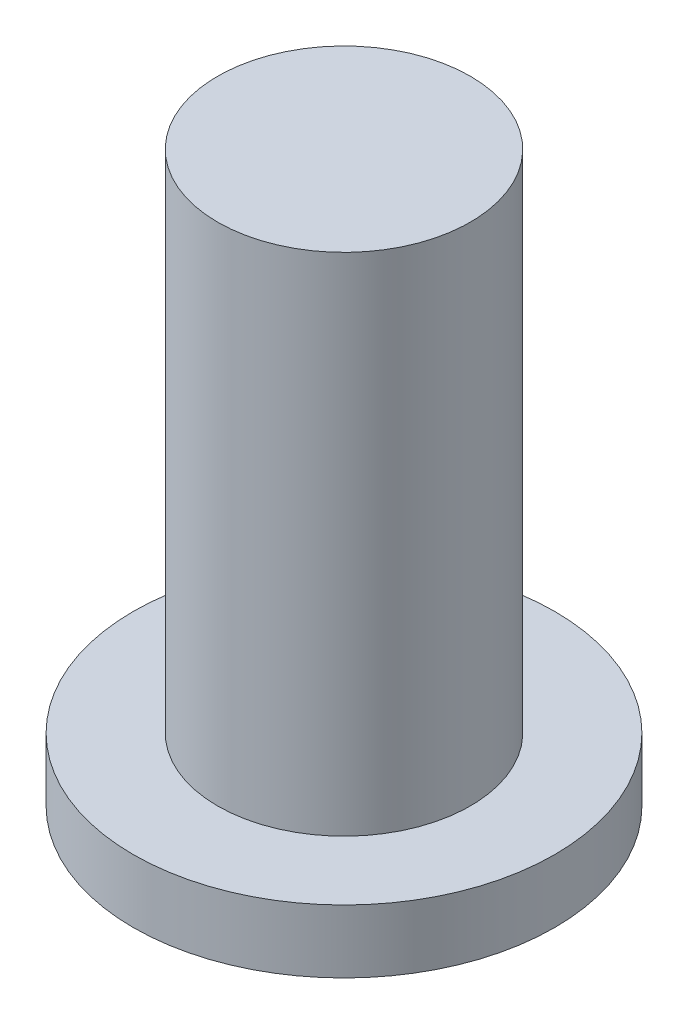
ISO-10303-21;
HEADER;
FILE_DESCRIPTION(('STEP AP214'),'2;1');
FILE_NAME('part.step','',(''),(''),'','','');
FILE_SCHEMA(('AUTOMOTIVE_DESIGN { 1 0 10303 214 1 1 1 1 }'));
ENDSEC;
DATA;
#1=APPLICATION_CONTEXT('core data for automotive mechanical design processes');
#2=APPLICATION_PROTOCOL_DEFINITION('international standard','automotive_design',2000,#1);
#3=PRODUCT_CONTEXT('',#1,'mechanical');
#4=PRODUCT('Part','Part','',(#3));
#5=PRODUCT_RELATED_PRODUCT_CATEGORY('part','',(#4));
#6=PRODUCT_DEFINITION_FORMATION('','',#4);
#7=PRODUCT_DEFINITION_CONTEXT('part definition',#1,'design');
#8=PRODUCT_DEFINITION('design','',#6,#7);
#9=PRODUCT_DEFINITION_SHAPE('','',#8);
#10=(LENGTH_UNIT() NAMED_UNIT(*) SI_UNIT(.MILLI.,.METRE.));
#11=(NAMED_UNIT(*) PLANE_ANGLE_UNIT() SI_UNIT($,.RADIAN.));
#12=(NAMED_UNIT(*) SI_UNIT($,.STERADIAN.) SOLID_ANGLE_UNIT());
#13=UNCERTAINTY_MEASURE_WITH_UNIT(LENGTH_MEASURE(1.E-05),#10,'distance_accuracy_value','');
#14=(GEOMETRIC_REPRESENTATION_CONTEXT(3) GLOBAL_UNCERTAINTY_ASSIGNED_CONTEXT((#13)) GLOBAL_UNIT_ASSIGNED_CONTEXT((#10,
#11,#12)) REPRESENTATION_CONTEXT('',''));
#15=CARTESIAN_POINT('',(0.,0.,0.));
#16=DIRECTION('',(0.,0.,1.));
#17=DIRECTION('',(1.,0.,0.));
#18=AXIS2_PLACEMENT_3D('',#15,#16,#17);
#19=CARTESIAN_POINT('',(0.,1.5,0.));
#20=DIRECTION('',(0.,-1.,0.));
#21=DIRECTION('',(0.,0.,-1.));
#22=AXIS2_PLACEMENT_3D('',#19,#20,#21);
#23=CYLINDRICAL_SURFACE('',#22,5.);
#24=CARTESIAN_POINT('',(0.,1.5,0.));
#25=DIRECTION('',(0.,1.,0.));
#26=DIRECTION('',(0.,0.,1.));
#27=AXIS2_PLACEMENT_3D('',#24,#25,#26);
#28=CIRCLE('',#27,5.);
#29=CARTESIAN_POINT('',(0.,1.5,5.));
#30=VERTEX_POINT('',#29);
#31=EDGE_CURVE('E48',#30,#30,#28,.T.);
#32=ORIENTED_EDGE('',*,*,#31,.F.);
#33=EDGE_LOOP('',(#32));
#34=FACE_BOUND('',#33,.T.);
#35=CARTESIAN_POINT('',(0.,0.,0.));
#36=DIRECTION('',(0.,1.,0.));
#37=DIRECTION('',(0.,0.,1.));
#38=AXIS2_PLACEMENT_3D('',#35,#36,#37);
#39=CIRCLE('',#38,5.);
#40=CARTESIAN_POINT('',(0.,0.,5.));
#41=VERTEX_POINT('',#40);
#42=EDGE_CURVE('E43',#41,#41,#39,.T.);
#43=ORIENTED_EDGE('',*,*,#42,.T.);
#44=EDGE_LOOP('',(#43));
#45=FACE_BOUND('',#44,.T.);
#46=ADVANCED_FACE('F40',(#34,#45),#23,.T.);
#47=CARTESIAN_POINT('',(0.,1.5,0.));
#48=DIRECTION('',(0.,1.,0.));
#49=DIRECTION('',(0.,0.,1.));
#50=AXIS2_PLACEMENT_3D('',#47,#48,#49);
#51=PLANE('',#50);
#52=CARTESIAN_POINT('',(0.,1.5,0.));
#53=DIRECTION('',(0.,1.,0.));
#54=DIRECTION('',(0.,0.,1.));
#55=AXIS2_PLACEMENT_3D('',#52,#53,#54);
#56=CIRCLE('',#55,3.);
#57=CARTESIAN_POINT('',(0.,1.5,3.));
#58=VERTEX_POINT('',#57);
#59=EDGE_CURVE('E10',#58,#58,#56,.T.);
#60=ORIENTED_EDGE('',*,*,#59,.F.);
#61=EDGE_LOOP('',(#60));
#62=FACE_BOUND('',#61,.T.);
#63=ORIENTED_EDGE('',*,*,#31,.T.);
#64=EDGE_LOOP('',(#63));
#65=FACE_BOUND('',#64,.T.);
#66=ADVANCED_FACE('F68',(#62,#65),#51,.T.);
#67=CARTESIAN_POINT('',(0.,0.,0.));
#68=DIRECTION('',(0.,1.,0.));
#69=DIRECTION('',(0.,0.,1.));
#70=AXIS2_PLACEMENT_3D('',#67,#68,#69);
#71=PLANE('',#70);
#72=ORIENTED_EDGE('',*,*,#42,.F.);
#73=EDGE_LOOP('',(#72));
#74=FACE_BOUND('',#73,.T.);
#75=ADVANCED_FACE('F65',(#74),#71,.F.);
#76=CARTESIAN_POINT('',(0.,13.5,0.));
#77=DIRECTION('',(0.,-1.,0.));
#78=DIRECTION('',(0.,0.,-1.));
#79=AXIS2_PLACEMENT_3D('',#76,#77,#78);
#80=CYLINDRICAL_SURFACE('',#79,3.);
#81=CARTESIAN_POINT('',(0.,13.5,0.));
#82=DIRECTION('',(0.,1.,0.));
#83=DIRECTION('',(0.,0.,1.));
#84=AXIS2_PLACEMENT_3D('',#81,#82,#83);
#85=CIRCLE('',#84,3.);
#86=CARTESIAN_POINT('',(0.,13.5,3.));
#87=VERTEX_POINT('',#86);
#88=EDGE_CURVE('E55',#87,#87,#85,.T.);
#89=ORIENTED_EDGE('',*,*,#88,.F.);
#90=EDGE_LOOP('',(#89));
#91=FACE_BOUND('',#90,.T.);
#92=ORIENTED_EDGE('',*,*,#59,.T.);
#93=EDGE_LOOP('',(#92));
#94=FACE_BOUND('',#93,.T.);
#95=ADVANCED_FACE('F67',(#91,#94),#80,.T.);
#96=CARTESIAN_POINT('',(0.,13.5,0.));
#97=DIRECTION('',(0.,1.,0.));
#98=DIRECTION('',(0.,0.,1.));
#99=AXIS2_PLACEMENT_3D('',#96,#97,#98);
#100=PLANE('',#99);
#101=ORIENTED_EDGE('',*,*,#88,.T.);
#102=EDGE_LOOP('',(#101));
#103=FACE_BOUND('',#102,.T.);
#104=ADVANCED_FACE('F73',(#103),#100,.T.);
#105=CLOSED_SHELL('',(#46,#66,#75,#95,#104));
#106=MANIFOLD_SOLID_BREP('B2',#105);
#107=ADVANCED_BREP_SHAPE_REPRESENTATION('',(#18,#106),#14);
#108=SHAPE_DEFINITION_REPRESENTATION(#9,#107);
ENDSEC;
END-ISO-10303-21;
